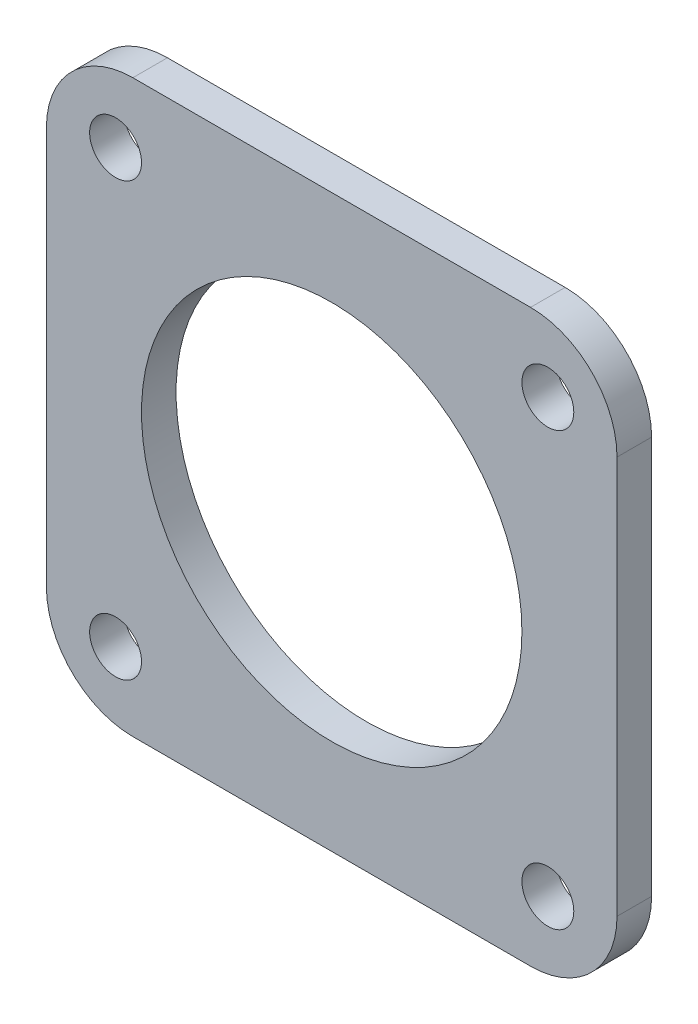
ISO-10303-21;
HEADER;
FILE_DESCRIPTION(('STEP AP214'),'2;1');
FILE_NAME('part.step','',(''),(''),'','','');
FILE_SCHEMA(('AUTOMOTIVE_DESIGN { 1 0 10303 214 1 1 1 1 }'));
ENDSEC;
DATA;
#1=APPLICATION_CONTEXT('core data for automotive mechanical design processes');
#2=APPLICATION_PROTOCOL_DEFINITION('international standard','automotive_design',2000,#1);
#3=PRODUCT_CONTEXT('',#1,'mechanical');
#4=PRODUCT('Part','Part','',(#3));
#5=PRODUCT_RELATED_PRODUCT_CATEGORY('part','',(#4));
#6=PRODUCT_DEFINITION_FORMATION('','',#4);
#7=PRODUCT_DEFINITION_CONTEXT('part definition',#1,'design');
#8=PRODUCT_DEFINITION('design','',#6,#7);
#9=PRODUCT_DEFINITION_SHAPE('','',#8);
#10=(LENGTH_UNIT() NAMED_UNIT(*) SI_UNIT(.MILLI.,.METRE.));
#11=(NAMED_UNIT(*) PLANE_ANGLE_UNIT() SI_UNIT($,.RADIAN.));
#12=(NAMED_UNIT(*) SI_UNIT($,.STERADIAN.) SOLID_ANGLE_UNIT());
#13=UNCERTAINTY_MEASURE_WITH_UNIT(LENGTH_MEASURE(1.E-05),#10,'distance_accuracy_value','');
#14=(GEOMETRIC_REPRESENTATION_CONTEXT(3) GLOBAL_UNCERTAINTY_ASSIGNED_CONTEXT((#13)) GLOBAL_UNIT_ASSIGNED_CONTEXT((#10,
#11,#12)) REPRESENTATION_CONTEXT('',''));
#15=CARTESIAN_POINT('',(0.,0.,0.));
#16=DIRECTION('',(0.,0.,1.));
#17=DIRECTION('',(1.,0.,0.));
#18=AXIS2_PLACEMENT_3D('',#15,#16,#17);
#19=CARTESIAN_POINT('',(16.5,16.5,2.));
#20=DIRECTION('',(-1.,0.,0.));
#21=DIRECTION('',(0.,-1.,0.));
#22=AXIS2_PLACEMENT_3D('',#19,#20,#21);
#23=PLANE('',#22);
#24=DIRECTION('',(0.,1.,0.));
#25=VECTOR('',#24,1.);
#26=CARTESIAN_POINT('',(16.5,16.5,2.));
#27=LINE('',#26,#25);
#28=CARTESIAN_POINT('',(16.5,-11.5,2.));
#29=VERTEX_POINT('',#28);
#30=CARTESIAN_POINT('',(16.5,11.5,2.));
#31=VERTEX_POINT('',#30);
#32=EDGE_CURVE('E139',#29,#31,#27,.T.);
#33=ORIENTED_EDGE('',*,*,#32,.F.);
#34=DIRECTION('',(0.,0.,-1.));
#35=VECTOR('',#34,1.);
#36=CARTESIAN_POINT('',(16.5,-11.5,2.));
#37=LINE('',#36,#35);
#38=CARTESIAN_POINT('',(16.5,-11.5,0.));
#39=VERTEX_POINT('',#38);
#40=EDGE_CURVE('E11',#29,#39,#37,.T.);
#41=ORIENTED_EDGE('',*,*,#40,.T.);
#42=DIRECTION('',(0.,1.,0.));
#43=VECTOR('',#42,1.);
#44=CARTESIAN_POINT('',(16.5,16.5,0.));
#45=LINE('',#44,#43);
#46=CARTESIAN_POINT('',(16.5,11.5,0.));
#47=VERTEX_POINT('',#46);
#48=EDGE_CURVE('E141',#39,#47,#45,.T.);
#49=ORIENTED_EDGE('',*,*,#48,.T.);
#50=DIRECTION('',(0.,0.,-1.));
#51=VECTOR('',#50,1.);
#52=CARTESIAN_POINT('',(16.5,11.5,2.));
#53=LINE('',#52,#51);
#54=EDGE_CURVE('E47',#47,#31,#53,.F.);
#55=ORIENTED_EDGE('',*,*,#54,.T.);
#56=EDGE_LOOP('',(#33,#41,#49,#55));
#57=FACE_BOUND('',#56,.T.);
#58=ADVANCED_FACE('F38',(#57),#23,.F.);
#59=CARTESIAN_POINT('',(-16.5,16.5,2.));
#60=DIRECTION('',(0.,-1.,0.));
#61=DIRECTION('',(0.,0.,-1.));
#62=AXIS2_PLACEMENT_3D('',#59,#60,#61);
#63=PLANE('',#62);
#64=DIRECTION('',(-1.,0.,0.));
#65=VECTOR('',#64,1.);
#66=CARTESIAN_POINT('',(-16.5,16.5,0.));
#67=LINE('',#66,#65);
#68=CARTESIAN_POINT('',(11.5,16.5,0.));
#69=VERTEX_POINT('',#68);
#70=CARTESIAN_POINT('',(-11.5,16.5,0.));
#71=VERTEX_POINT('',#70);
#72=EDGE_CURVE('E135',#69,#71,#67,.T.);
#73=ORIENTED_EDGE('',*,*,#72,.T.);
#74=DIRECTION('',(0.,0.,-1.));
#75=VECTOR('',#74,1.);
#76=CARTESIAN_POINT('',(-11.5,16.5,2.));
#77=LINE('',#76,#75);
#78=CARTESIAN_POINT('',(-11.5,16.5,2.));
#79=VERTEX_POINT('',#78);
#80=EDGE_CURVE('E111',#71,#79,#77,.F.);
#81=ORIENTED_EDGE('',*,*,#80,.T.);
#82=DIRECTION('',(-1.,0.,0.));
#83=VECTOR('',#82,1.);
#84=CARTESIAN_POINT('',(-16.5,16.5,2.));
#85=LINE('',#84,#83);
#86=CARTESIAN_POINT('',(11.5,16.5,2.));
#87=VERTEX_POINT('',#86);
#88=EDGE_CURVE('E191',#87,#79,#85,.T.);
#89=ORIENTED_EDGE('',*,*,#88,.F.);
#90=DIRECTION('',(0.,0.,-1.));
#91=VECTOR('',#90,1.);
#92=CARTESIAN_POINT('',(11.5,16.5,2.));
#93=LINE('',#92,#91);
#94=EDGE_CURVE('E117',#87,#69,#93,.T.);
#95=ORIENTED_EDGE('',*,*,#94,.T.);
#96=EDGE_LOOP('',(#73,#81,#89,#95));
#97=FACE_BOUND('',#96,.T.);
#98=ADVANCED_FACE('F195',(#97),#63,.F.);
#99=CARTESIAN_POINT('',(-16.5,16.5,2.));
#100=DIRECTION('',(1.,0.,0.));
#101=DIRECTION('',(0.,1.,0.));
#102=AXIS2_PLACEMENT_3D('',#99,#100,#101);
#103=PLANE('',#102);
#104=DIRECTION('',(0.,-1.,0.));
#105=VECTOR('',#104,1.);
#106=CARTESIAN_POINT('',(-16.5,16.5,2.));
#107=LINE('',#106,#105);
#108=CARTESIAN_POINT('',(-16.5,11.5,2.));
#109=VERTEX_POINT('',#108);
#110=CARTESIAN_POINT('',(-16.5,-11.5,2.));
#111=VERTEX_POINT('',#110);
#112=EDGE_CURVE('E126',#109,#111,#107,.T.);
#113=ORIENTED_EDGE('',*,*,#112,.F.);
#114=DIRECTION('',(0.,0.,-1.));
#115=VECTOR('',#114,1.);
#116=CARTESIAN_POINT('',(-16.5,11.5,2.));
#117=LINE('',#116,#115);
#118=CARTESIAN_POINT('',(-16.5,11.5,0.));
#119=VERTEX_POINT('',#118);
#120=EDGE_CURVE('E110',#109,#119,#117,.T.);
#121=ORIENTED_EDGE('',*,*,#120,.T.);
#122=DIRECTION('',(0.,-1.,0.));
#123=VECTOR('',#122,1.);
#124=CARTESIAN_POINT('',(-16.5,16.5,0.));
#125=LINE('',#124,#123);
#126=CARTESIAN_POINT('',(-16.5,-11.5,0.));
#127=VERTEX_POINT('',#126);
#128=EDGE_CURVE('E124',#119,#127,#125,.T.);
#129=ORIENTED_EDGE('',*,*,#128,.T.);
#130=DIRECTION('',(0.,0.,-1.));
#131=VECTOR('',#130,1.);
#132=CARTESIAN_POINT('',(-16.5,-11.5,2.));
#133=LINE('',#132,#131);
#134=EDGE_CURVE('E129',#127,#111,#133,.F.);
#135=ORIENTED_EDGE('',*,*,#134,.T.);
#136=EDGE_LOOP('',(#113,#121,#129,#135));
#137=FACE_BOUND('',#136,.T.);
#138=ADVANCED_FACE('F123',(#137),#103,.F.);
#139=CARTESIAN_POINT('',(-16.5,-16.5,2.));
#140=DIRECTION('',(0.,1.,0.));
#141=DIRECTION('',(0.,0.,1.));
#142=AXIS2_PLACEMENT_3D('',#139,#140,#141);
#143=PLANE('',#142);
#144=DIRECTION('',(1.,0.,0.));
#145=VECTOR('',#144,1.);
#146=CARTESIAN_POINT('',(-16.5,-16.5,2.));
#147=LINE('',#146,#145);
#148=CARTESIAN_POINT('',(-11.5,-16.5,2.));
#149=VERTEX_POINT('',#148);
#150=CARTESIAN_POINT('',(11.5,-16.5,2.));
#151=VERTEX_POINT('',#150);
#152=EDGE_CURVE('E146',#149,#151,#147,.T.);
#153=ORIENTED_EDGE('',*,*,#152,.F.);
#154=DIRECTION('',(0.,0.,-1.));
#155=VECTOR('',#154,1.);
#156=CARTESIAN_POINT('',(-11.5,-16.5,2.));
#157=LINE('',#156,#155);
#158=CARTESIAN_POINT('',(-11.5,-16.5,0.));
#159=VERTEX_POINT('',#158);
#160=EDGE_CURVE('E173',#149,#159,#157,.T.);
#161=ORIENTED_EDGE('',*,*,#160,.T.);
#162=DIRECTION('',(1.,0.,0.));
#163=VECTOR('',#162,1.);
#164=CARTESIAN_POINT('',(-16.5,-16.5,0.));
#165=LINE('',#164,#163);
#166=CARTESIAN_POINT('',(11.5,-16.5,0.));
#167=VERTEX_POINT('',#166);
#168=EDGE_CURVE('E134',#159,#167,#165,.T.);
#169=ORIENTED_EDGE('',*,*,#168,.T.);
#170=DIRECTION('',(0.,0.,-1.));
#171=VECTOR('',#170,1.);
#172=CARTESIAN_POINT('',(11.5,-16.5,2.));
#173=LINE('',#172,#171);
#174=EDGE_CURVE('E54',#167,#151,#173,.F.);
#175=ORIENTED_EDGE('',*,*,#174,.T.);
#176=EDGE_LOOP('',(#153,#161,#169,#175));
#177=FACE_BOUND('',#176,.T.);
#178=ADVANCED_FACE('F255',(#177),#143,.F.);
#179=CARTESIAN_POINT('',(0.,0.,2.));
#180=DIRECTION('',(0.,0.,1.));
#181=DIRECTION('',(1.,0.,0.));
#182=AXIS2_PLACEMENT_3D('',#179,#180,#181);
#183=PLANE('',#182);
#184=CARTESIAN_POINT('',(0.,0.,2.));
#185=DIRECTION('',(0.,0.,1.));
#186=DIRECTION('',(1.,0.,0.));
#187=AXIS2_PLACEMENT_3D('',#184,#185,#186);
#188=CIRCLE('',#187,11.);
#189=CARTESIAN_POINT('',(11.,0.,2.));
#190=VERTEX_POINT('',#189);
#191=EDGE_CURVE('E237',#190,#190,#188,.T.);
#192=ORIENTED_EDGE('',*,*,#191,.F.);
#193=EDGE_LOOP('',(#192));
#194=FACE_BOUND('',#193,.T.);
#195=CARTESIAN_POINT('',(12.5,12.5,2.));
#196=DIRECTION('',(0.,0.,1.));
#197=DIRECTION('',(1.,0.,0.));
#198=AXIS2_PLACEMENT_3D('',#195,#196,#197);
#199=CIRCLE('',#198,1.5);
#200=CARTESIAN_POINT('',(14.,12.5,2.));
#201=VERTEX_POINT('',#200);
#202=EDGE_CURVE('E213',#201,#201,#199,.T.);
#203=ORIENTED_EDGE('',*,*,#202,.F.);
#204=EDGE_LOOP('',(#203));
#205=FACE_BOUND('',#204,.T.);
#206=CARTESIAN_POINT('',(12.5,-12.5,2.));
#207=DIRECTION('',(0.,0.,1.));
#208=DIRECTION('',(1.,0.,0.));
#209=AXIS2_PLACEMENT_3D('',#206,#207,#208);
#210=CIRCLE('',#209,1.5);
#211=CARTESIAN_POINT('',(14.,-12.5,2.));
#212=VERTEX_POINT('',#211);
#213=EDGE_CURVE('E222',#212,#212,#210,.T.);
#214=ORIENTED_EDGE('',*,*,#213,.F.);
#215=EDGE_LOOP('',(#214));
#216=FACE_BOUND('',#215,.T.);
#217=CARTESIAN_POINT('',(-12.5,-12.5,2.));
#218=DIRECTION('',(0.,0.,1.));
#219=DIRECTION('',(1.,0.,0.));
#220=AXIS2_PLACEMENT_3D('',#217,#218,#219);
#221=CIRCLE('',#220,1.5);
#222=CARTESIAN_POINT('',(-11.,-12.5,2.));
#223=VERTEX_POINT('',#222);
#224=EDGE_CURVE('E230',#223,#223,#221,.T.);
#225=ORIENTED_EDGE('',*,*,#224,.F.);
#226=EDGE_LOOP('',(#225));
#227=FACE_BOUND('',#226,.T.);
#228=CARTESIAN_POINT('',(-12.5,12.5,2.));
#229=DIRECTION('',(0.,0.,1.));
#230=DIRECTION('',(1.,0.,0.));
#231=AXIS2_PLACEMENT_3D('',#228,#229,#230);
#232=CIRCLE('',#231,1.5);
#233=CARTESIAN_POINT('',(-11.,12.5,2.));
#234=VERTEX_POINT('',#233);
#235=EDGE_CURVE('E200',#234,#234,#232,.T.);
#236=ORIENTED_EDGE('',*,*,#235,.F.);
#237=EDGE_LOOP('',(#236));
#238=FACE_BOUND('',#237,.T.);
#239=ORIENTED_EDGE('',*,*,#88,.T.);
#240=CARTESIAN_POINT('',(-11.5,11.5,2.));
#241=DIRECTION('',(0.,0.,1.));
#242=DIRECTION('',(1.,0.,0.));
#243=AXIS2_PLACEMENT_3D('',#240,#241,#242);
#244=CIRCLE('',#243,5.);
#245=EDGE_CURVE('E168',#79,#109,#244,.T.);
#246=ORIENTED_EDGE('',*,*,#245,.T.);
#247=ORIENTED_EDGE('',*,*,#112,.T.);
#248=CARTESIAN_POINT('',(-11.5,-11.5,2.));
#249=DIRECTION('',(0.,0.,1.));
#250=DIRECTION('',(1.,0.,0.));
#251=AXIS2_PLACEMENT_3D('',#248,#249,#250);
#252=CIRCLE('',#251,5.);
#253=EDGE_CURVE('E61',#111,#149,#252,.T.);
#254=ORIENTED_EDGE('',*,*,#253,.T.);
#255=ORIENTED_EDGE('',*,*,#152,.T.);
#256=CARTESIAN_POINT('',(11.5,-11.5,2.));
#257=DIRECTION('',(0.,0.,1.));
#258=DIRECTION('',(1.,0.,0.));
#259=AXIS2_PLACEMENT_3D('',#256,#257,#258);
#260=CIRCLE('',#259,5.);
#261=EDGE_CURVE('E163',#151,#29,#260,.T.);
#262=ORIENTED_EDGE('',*,*,#261,.T.);
#263=ORIENTED_EDGE('',*,*,#32,.T.);
#264=CARTESIAN_POINT('',(11.5,11.5,2.));
#265=DIRECTION('',(0.,0.,1.));
#266=DIRECTION('',(1.,0.,0.));
#267=AXIS2_PLACEMENT_3D('',#264,#265,#266);
#268=CIRCLE('',#267,5.);
#269=EDGE_CURVE('E160',#31,#87,#268,.T.);
#270=ORIENTED_EDGE('',*,*,#269,.T.);
#271=EDGE_LOOP('',(#239,#246,#247,#254,#255,#262,#263,#270));
#272=FACE_BOUND('',#271,.T.);
#273=ADVANCED_FACE('F187',(#194,#205,#216,#227,#238,#272),#183,.T.);
#274=CARTESIAN_POINT('',(0.,0.,0.));
#275=DIRECTION('',(0.,0.,1.));
#276=DIRECTION('',(1.,0.,0.));
#277=AXIS2_PLACEMENT_3D('',#274,#275,#276);
#278=PLANE('',#277);
#279=CARTESIAN_POINT('',(0.,0.,0.));
#280=DIRECTION('',(0.,0.,1.));
#281=DIRECTION('',(1.,0.,0.));
#282=AXIS2_PLACEMENT_3D('',#279,#280,#281);
#283=CIRCLE('',#282,11.);
#284=CARTESIAN_POINT('',(11.,0.,0.));
#285=VERTEX_POINT('',#284);
#286=EDGE_CURVE('E218',#285,#285,#283,.T.);
#287=ORIENTED_EDGE('',*,*,#286,.T.);
#288=EDGE_LOOP('',(#287));
#289=FACE_BOUND('',#288,.T.);
#290=CARTESIAN_POINT('',(12.5,12.5,0.));
#291=DIRECTION('',(0.,0.,1.));
#292=DIRECTION('',(1.,0.,0.));
#293=AXIS2_PLACEMENT_3D('',#290,#291,#292);
#294=CIRCLE('',#293,1.5);
#295=CARTESIAN_POINT('',(14.,12.5,0.));
#296=VERTEX_POINT('',#295);
#297=EDGE_CURVE('E217',#296,#296,#294,.T.);
#298=ORIENTED_EDGE('',*,*,#297,.T.);
#299=EDGE_LOOP('',(#298));
#300=FACE_BOUND('',#299,.T.);
#301=CARTESIAN_POINT('',(12.5,-12.5,0.));
#302=DIRECTION('',(0.,0.,1.));
#303=DIRECTION('',(1.,0.,0.));
#304=AXIS2_PLACEMENT_3D('',#301,#302,#303);
#305=CIRCLE('',#304,1.5);
#306=CARTESIAN_POINT('',(14.,-12.5,0.));
#307=VERTEX_POINT('',#306);
#308=EDGE_CURVE('E226',#307,#307,#305,.T.);
#309=ORIENTED_EDGE('',*,*,#308,.T.);
#310=EDGE_LOOP('',(#309));
#311=FACE_BOUND('',#310,.T.);
#312=CARTESIAN_POINT('',(-12.5,-12.5,0.));
#313=DIRECTION('',(0.,0.,1.));
#314=DIRECTION('',(1.,0.,0.));
#315=AXIS2_PLACEMENT_3D('',#312,#313,#314);
#316=CIRCLE('',#315,1.5);
#317=CARTESIAN_POINT('',(-11.,-12.5,0.));
#318=VERTEX_POINT('',#317);
#319=EDGE_CURVE('E211',#318,#318,#316,.T.);
#320=ORIENTED_EDGE('',*,*,#319,.T.);
#321=EDGE_LOOP('',(#320));
#322=FACE_BOUND('',#321,.T.);
#323=CARTESIAN_POINT('',(-12.5,12.5,0.));
#324=DIRECTION('',(0.,0.,1.));
#325=DIRECTION('',(1.,0.,0.));
#326=AXIS2_PLACEMENT_3D('',#323,#324,#325);
#327=CIRCLE('',#326,1.5);
#328=CARTESIAN_POINT('',(-11.,12.5,0.));
#329=VERTEX_POINT('',#328);
#330=EDGE_CURVE('E197',#329,#329,#327,.T.);
#331=ORIENTED_EDGE('',*,*,#330,.T.);
#332=EDGE_LOOP('',(#331));
#333=FACE_BOUND('',#332,.T.);
#334=ORIENTED_EDGE('',*,*,#128,.F.);
#335=CARTESIAN_POINT('',(-11.5,11.5,0.));
#336=DIRECTION('',(0.,0.,1.));
#337=DIRECTION('',(1.,0.,0.));
#338=AXIS2_PLACEMENT_3D('',#335,#336,#337);
#339=CIRCLE('',#338,5.);
#340=EDGE_CURVE('E106',#119,#71,#339,.F.);
#341=ORIENTED_EDGE('',*,*,#340,.T.);
#342=ORIENTED_EDGE('',*,*,#72,.F.);
#343=CARTESIAN_POINT('',(11.5,11.5,0.));
#344=DIRECTION('',(0.,0.,1.));
#345=DIRECTION('',(1.,0.,0.));
#346=AXIS2_PLACEMENT_3D('',#343,#344,#345);
#347=CIRCLE('',#346,5.);
#348=EDGE_CURVE('E128',#69,#47,#347,.F.);
#349=ORIENTED_EDGE('',*,*,#348,.T.);
#350=ORIENTED_EDGE('',*,*,#48,.F.);
#351=CARTESIAN_POINT('',(11.5,-11.5,0.));
#352=DIRECTION('',(0.,0.,1.));
#353=DIRECTION('',(1.,0.,0.));
#354=AXIS2_PLACEMENT_3D('',#351,#352,#353);
#355=CIRCLE('',#354,5.);
#356=EDGE_CURVE('E150',#39,#167,#355,.F.);
#357=ORIENTED_EDGE('',*,*,#356,.T.);
#358=ORIENTED_EDGE('',*,*,#168,.F.);
#359=CARTESIAN_POINT('',(-11.5,-11.5,0.));
#360=DIRECTION('',(0.,0.,1.));
#361=DIRECTION('',(1.,0.,0.));
#362=AXIS2_PLACEMENT_3D('',#359,#360,#361);
#363=CIRCLE('',#362,5.);
#364=EDGE_CURVE('E118',#159,#127,#363,.F.);
#365=ORIENTED_EDGE('',*,*,#364,.T.);
#366=EDGE_LOOP('',(#334,#341,#342,#349,#350,#357,#358,#365));
#367=FACE_BOUND('',#366,.T.);
#368=ADVANCED_FACE('F131',(#289,#300,#311,#322,#333,#367),#278,.F.);
#369=CARTESIAN_POINT('',(-12.5,12.5,0.));
#370=DIRECTION('',(0.,0.,1.));
#371=DIRECTION('',(1.,0.,0.));
#372=AXIS2_PLACEMENT_3D('',#369,#370,#371);
#373=CYLINDRICAL_SURFACE('',#372,1.5);
#374=ORIENTED_EDGE('',*,*,#330,.F.);
#375=EDGE_LOOP('',(#374));
#376=FACE_BOUND('',#375,.T.);
#377=ORIENTED_EDGE('',*,*,#235,.T.);
#378=EDGE_LOOP('',(#377));
#379=FACE_BOUND('',#378,.T.);
#380=ADVANCED_FACE('F265',(#376,#379),#373,.F.);
#381=CARTESIAN_POINT('',(-12.5,-12.5,0.));
#382=DIRECTION('',(0.,0.,1.));
#383=DIRECTION('',(1.,0.,0.));
#384=AXIS2_PLACEMENT_3D('',#381,#382,#383);
#385=CYLINDRICAL_SURFACE('',#384,1.5);
#386=ORIENTED_EDGE('',*,*,#319,.F.);
#387=EDGE_LOOP('',(#386));
#388=FACE_BOUND('',#387,.T.);
#389=ORIENTED_EDGE('',*,*,#224,.T.);
#390=EDGE_LOOP('',(#389));
#391=FACE_BOUND('',#390,.T.);
#392=ADVANCED_FACE('F267',(#388,#391),#385,.F.);
#393=CARTESIAN_POINT('',(12.5,-12.5,0.));
#394=DIRECTION('',(0.,0.,1.));
#395=DIRECTION('',(1.,0.,0.));
#396=AXIS2_PLACEMENT_3D('',#393,#394,#395);
#397=CYLINDRICAL_SURFACE('',#396,1.5);
#398=ORIENTED_EDGE('',*,*,#308,.F.);
#399=EDGE_LOOP('',(#398));
#400=FACE_BOUND('',#399,.T.);
#401=ORIENTED_EDGE('',*,*,#213,.T.);
#402=EDGE_LOOP('',(#401));
#403=FACE_BOUND('',#402,.T.);
#404=ADVANCED_FACE('F274',(#400,#403),#397,.F.);
#405=CARTESIAN_POINT('',(12.5,12.5,0.));
#406=DIRECTION('',(0.,0.,1.));
#407=DIRECTION('',(1.,0.,0.));
#408=AXIS2_PLACEMENT_3D('',#405,#406,#407);
#409=CYLINDRICAL_SURFACE('',#408,1.5);
#410=ORIENTED_EDGE('',*,*,#297,.F.);
#411=EDGE_LOOP('',(#410));
#412=FACE_BOUND('',#411,.T.);
#413=ORIENTED_EDGE('',*,*,#202,.T.);
#414=EDGE_LOOP('',(#413));
#415=FACE_BOUND('',#414,.T.);
#416=ADVANCED_FACE('F292',(#412,#415),#409,.F.);
#417=CARTESIAN_POINT('',(-11.5,11.5,2.));
#418=DIRECTION('',(0.,0.,-1.));
#419=DIRECTION('',(-1.,0.,0.));
#420=AXIS2_PLACEMENT_3D('',#417,#418,#419);
#421=CYLINDRICAL_SURFACE('',#420,5.);
#422=ORIENTED_EDGE('',*,*,#245,.F.);
#423=ORIENTED_EDGE('',*,*,#80,.F.);
#424=ORIENTED_EDGE('',*,*,#340,.F.);
#425=ORIENTED_EDGE('',*,*,#120,.F.);
#426=EDGE_LOOP('',(#422,#423,#424,#425));
#427=FACE_BOUND('',#426,.T.);
#428=ADVANCED_FACE('F109',(#427),#421,.T.);
#429=CARTESIAN_POINT('',(-11.5,-11.5,2.));
#430=DIRECTION('',(0.,0.,-1.));
#431=DIRECTION('',(-1.,0.,0.));
#432=AXIS2_PLACEMENT_3D('',#429,#430,#431);
#433=CYLINDRICAL_SURFACE('',#432,5.);
#434=ORIENTED_EDGE('',*,*,#253,.F.);
#435=ORIENTED_EDGE('',*,*,#134,.F.);
#436=ORIENTED_EDGE('',*,*,#364,.F.);
#437=ORIENTED_EDGE('',*,*,#160,.F.);
#438=EDGE_LOOP('',(#434,#435,#436,#437));
#439=FACE_BOUND('',#438,.T.);
#440=ADVANCED_FACE('F291',(#439),#433,.T.);
#441=CARTESIAN_POINT('',(11.5,-11.5,2.));
#442=DIRECTION('',(0.,0.,-1.));
#443=DIRECTION('',(-1.,0.,0.));
#444=AXIS2_PLACEMENT_3D('',#441,#442,#443);
#445=CYLINDRICAL_SURFACE('',#444,5.);
#446=ORIENTED_EDGE('',*,*,#261,.F.);
#447=ORIENTED_EDGE('',*,*,#174,.F.);
#448=ORIENTED_EDGE('',*,*,#356,.F.);
#449=ORIENTED_EDGE('',*,*,#40,.F.);
#450=EDGE_LOOP('',(#446,#447,#448,#449));
#451=FACE_BOUND('',#450,.T.);
#452=ADVANCED_FACE('F294',(#451),#445,.T.);
#453=CARTESIAN_POINT('',(11.5,11.5,2.));
#454=DIRECTION('',(0.,0.,-1.));
#455=DIRECTION('',(-1.,0.,0.));
#456=AXIS2_PLACEMENT_3D('',#453,#454,#455);
#457=CYLINDRICAL_SURFACE('',#456,5.);
#458=ORIENTED_EDGE('',*,*,#269,.F.);
#459=ORIENTED_EDGE('',*,*,#54,.F.);
#460=ORIENTED_EDGE('',*,*,#348,.F.);
#461=ORIENTED_EDGE('',*,*,#94,.F.);
#462=EDGE_LOOP('',(#458,#459,#460,#461));
#463=FACE_BOUND('',#462,.T.);
#464=ADVANCED_FACE('F40',(#463),#457,.T.);
#465=CARTESIAN_POINT('',(0.,0.,0.));
#466=DIRECTION('',(0.,0.,1.));
#467=DIRECTION('',(1.,0.,0.));
#468=AXIS2_PLACEMENT_3D('',#465,#466,#467);
#469=CYLINDRICAL_SURFACE('',#468,11.);
#470=ORIENTED_EDGE('',*,*,#286,.F.);
#471=EDGE_LOOP('',(#470));
#472=FACE_BOUND('',#471,.T.);
#473=ORIENTED_EDGE('',*,*,#191,.T.);
#474=EDGE_LOOP('',(#473));
#475=FACE_BOUND('',#474,.T.);
#476=ADVANCED_FACE('F247',(#472,#475),#469,.F.);
#477=CLOSED_SHELL('',(#58,#98,#138,#178,#273,#368,#380,#392,#404,#416,#428,#440,#452,#464,#476));
#478=MANIFOLD_SOLID_BREP('B2',#477);
#479=ADVANCED_BREP_SHAPE_REPRESENTATION('',(#18,#478),#14);
#480=SHAPE_DEFINITION_REPRESENTATION(#9,#479);
ENDSEC;
END-ISO-10303-21;
